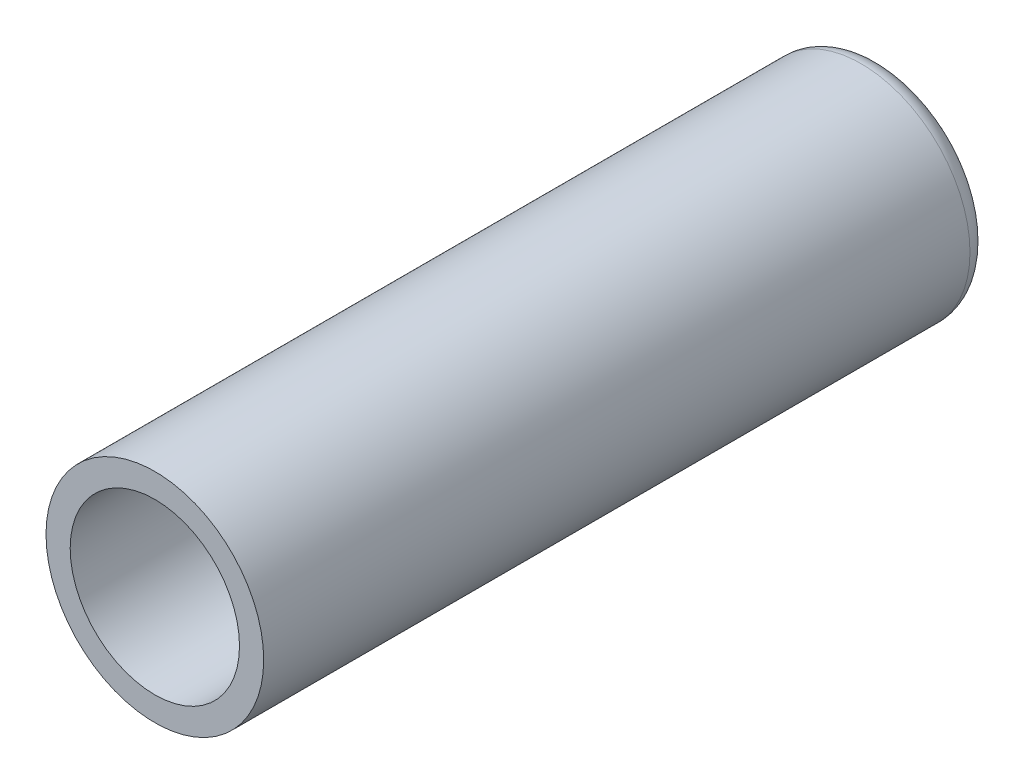
ISO-10303-21;
HEADER;
FILE_DESCRIPTION(('STEP AP214'),'2;1');
FILE_NAME('part.step','',(''),(''),'','','');
FILE_SCHEMA(('AUTOMOTIVE_DESIGN { 1 0 10303 214 1 1 1 1 }'));
ENDSEC;
DATA;
#1=APPLICATION_CONTEXT('core data for automotive mechanical design processes');
#2=APPLICATION_PROTOCOL_DEFINITION('international standard','automotive_design',2000,#1);
#3=PRODUCT_CONTEXT('',#1,'mechanical');
#4=PRODUCT('Part','Part','',(#3));
#5=PRODUCT_RELATED_PRODUCT_CATEGORY('part','',(#4));
#6=PRODUCT_DEFINITION_FORMATION('','',#4);
#7=PRODUCT_DEFINITION_CONTEXT('part definition',#1,'design');
#8=PRODUCT_DEFINITION('design','',#6,#7);
#9=PRODUCT_DEFINITION_SHAPE('','',#8);
#10=(LENGTH_UNIT() NAMED_UNIT(*) SI_UNIT(.MILLI.,.METRE.));
#11=(NAMED_UNIT(*) PLANE_ANGLE_UNIT() SI_UNIT($,.RADIAN.));
#12=(NAMED_UNIT(*) SI_UNIT($,.STERADIAN.) SOLID_ANGLE_UNIT());
#13=UNCERTAINTY_MEASURE_WITH_UNIT(LENGTH_MEASURE(1.E-05),#10,'distance_accuracy_value','');
#14=(GEOMETRIC_REPRESENTATION_CONTEXT(3) GLOBAL_UNCERTAINTY_ASSIGNED_CONTEXT((#13)) GLOBAL_UNIT_ASSIGNED_CONTEXT((#10,
#11,#12)) REPRESENTATION_CONTEXT('',''));
#15=CARTESIAN_POINT('',(0.,0.,0.));
#16=DIRECTION('',(0.,0.,1.));
#17=DIRECTION('',(1.,0.,0.));
#18=AXIS2_PLACEMENT_3D('',#15,#16,#17);
#19=CARTESIAN_POINT('',(0.,0.,95.25));
#20=DIRECTION('',(0.,0.,-1.));
#21=DIRECTION('',(-1.,0.,0.));
#22=AXIS2_PLACEMENT_3D('',#19,#20,#21);
#23=CYLINDRICAL_SURFACE('',#22,14.2875);
#24=CARTESIAN_POINT('',(0.,0.,2.54));
#25=DIRECTION('',(0.,0.,1.));
#26=DIRECTION('',(1.,0.,0.));
#27=AXIS2_PLACEMENT_3D('',#24,#25,#26);
#28=CIRCLE('',#27,14.2875);
#29=CARTESIAN_POINT('',(14.2875,0.,2.54));
#30=VERTEX_POINT('',#29);
#31=EDGE_CURVE('E46',#30,#30,#28,.T.);
#32=ORIENTED_EDGE('',*,*,#31,.T.);
#33=EDGE_LOOP('',(#32));
#34=FACE_BOUND('',#33,.T.);
#35=CARTESIAN_POINT('',(0.,0.,95.25));
#36=DIRECTION('',(0.,0.,1.));
#37=DIRECTION('',(1.,0.,0.));
#38=AXIS2_PLACEMENT_3D('',#35,#36,#37);
#39=CIRCLE('',#38,14.2875);
#40=CARTESIAN_POINT('',(14.2875,0.,95.25));
#41=VERTEX_POINT('',#40);
#42=EDGE_CURVE('E50',#41,#41,#39,.T.);
#43=ORIENTED_EDGE('',*,*,#42,.F.);
#44=EDGE_LOOP('',(#43));
#45=FACE_BOUND('',#44,.T.);
#46=ADVANCED_FACE('F39',(#34,#45),#23,.T.);
#47=CARTESIAN_POINT('',(0.,0.,95.25));
#48=DIRECTION('',(0.,0.,1.));
#49=DIRECTION('',(1.,0.,0.));
#50=AXIS2_PLACEMENT_3D('',#47,#48,#49);
#51=PLANE('',#50);
#52=CARTESIAN_POINT('',(0.,0.,95.25));
#53=DIRECTION('',(0.,0.,1.));
#54=DIRECTION('',(1.,0.,0.));
#55=AXIS2_PLACEMENT_3D('',#52,#53,#54);
#56=CIRCLE('',#55,11.1125);
#57=CARTESIAN_POINT('',(11.1125,0.,95.25));
#58=VERTEX_POINT('',#57);
#59=EDGE_CURVE('E59',#58,#58,#56,.T.);
#60=ORIENTED_EDGE('',*,*,#59,.F.);
#61=EDGE_LOOP('',(#60));
#62=FACE_BOUND('',#61,.T.);
#63=ORIENTED_EDGE('',*,*,#42,.T.);
#64=EDGE_LOOP('',(#63));
#65=FACE_BOUND('',#64,.T.);
#66=ADVANCED_FACE('F65',(#62,#65),#51,.T.);
#67=CARTESIAN_POINT('',(0.,0.,0.));
#68=DIRECTION('',(0.,0.,1.));
#69=DIRECTION('',(1.,0.,0.));
#70=AXIS2_PLACEMENT_3D('',#67,#68,#69);
#71=PLANE('',#70);
#72=CARTESIAN_POINT('',(0.,0.,0.));
#73=DIRECTION('',(0.,0.,1.));
#74=DIRECTION('',(1.,0.,0.));
#75=AXIS2_PLACEMENT_3D('',#72,#73,#74);
#76=CIRCLE('',#75,11.7475);
#77=CARTESIAN_POINT('',(11.7475,0.,0.));
#78=VERTEX_POINT('',#77);
#79=EDGE_CURVE('E11',#78,#78,#76,.F.);
#80=ORIENTED_EDGE('',*,*,#79,.T.);
#81=EDGE_LOOP('',(#80));
#82=FACE_BOUND('',#81,.T.);
#83=ADVANCED_FACE('F68',(#82),#71,.F.);
#84=CARTESIAN_POINT('',(0.,0.,-31.4308964237421));
#85=DIRECTION('',(0.,0.,1.));
#86=DIRECTION('',(1.,0.,0.));
#87=AXIS2_PLACEMENT_3D('',#84,#85,#86);
#88=CYLINDRICAL_SURFACE('',#87,11.1125);
#89=CARTESIAN_POINT('',(0.,0.,3.175));
#90=DIRECTION('',(0.,0.,1.));
#91=DIRECTION('',(1.,0.,0.));
#92=AXIS2_PLACEMENT_3D('',#89,#90,#91);
#93=CIRCLE('',#92,11.1125);
#94=CARTESIAN_POINT('',(11.1125,0.,3.175));
#95=VERTEX_POINT('',#94);
#96=EDGE_CURVE('E54',#95,#95,#93,.F.);
#97=ORIENTED_EDGE('',*,*,#96,.T.);
#98=EDGE_LOOP('',(#97));
#99=FACE_BOUND('',#98,.T.);
#100=ORIENTED_EDGE('',*,*,#59,.T.);
#101=EDGE_LOOP('',(#100));
#102=FACE_BOUND('',#101,.T.);
#103=ADVANCED_FACE('F63',(#99,#102),#88,.F.);
#104=CARTESIAN_POINT('',(0.,0.,3.175));
#105=DIRECTION('',(0.,0.,1.));
#106=DIRECTION('',(1.,0.,0.));
#107=AXIS2_PLACEMENT_3D('',#104,#105,#106);
#108=PLANE('',#107);
#109=ORIENTED_EDGE('',*,*,#96,.F.);
#110=EDGE_LOOP('',(#109));
#111=FACE_BOUND('',#110,.T.);
#112=ADVANCED_FACE('F80',(#111),#108,.T.);
#113=CARTESIAN_POINT('',(0.,0.,2.54));
#114=DIRECTION('',(0.,0.,1.));
#115=DIRECTION('',(1.,0.,0.));
#116=AXIS2_PLACEMENT_3D('',#113,#114,#115);
#117=TOROIDAL_SURFACE('',#116,11.7475,2.54);
#118=ORIENTED_EDGE('',*,*,#79,.F.);
#119=EDGE_LOOP('',(#118));
#120=FACE_BOUND('',#119,.T.);
#121=ORIENTED_EDGE('',*,*,#31,.F.);
#122=EDGE_LOOP('',(#121));
#123=FACE_BOUND('',#122,.T.);
#124=ADVANCED_FACE('F41',(#120,#123),#117,.T.);
#125=CLOSED_SHELL('',(#46,#66,#83,#103,#112,#124));
#126=MANIFOLD_SOLID_BREP('B2',#125);
#127=ADVANCED_BREP_SHAPE_REPRESENTATION('',(#18,#126),#14);
#128=SHAPE_DEFINITION_REPRESENTATION(#9,#127);
ENDSEC;
END-ISO-10303-21;
